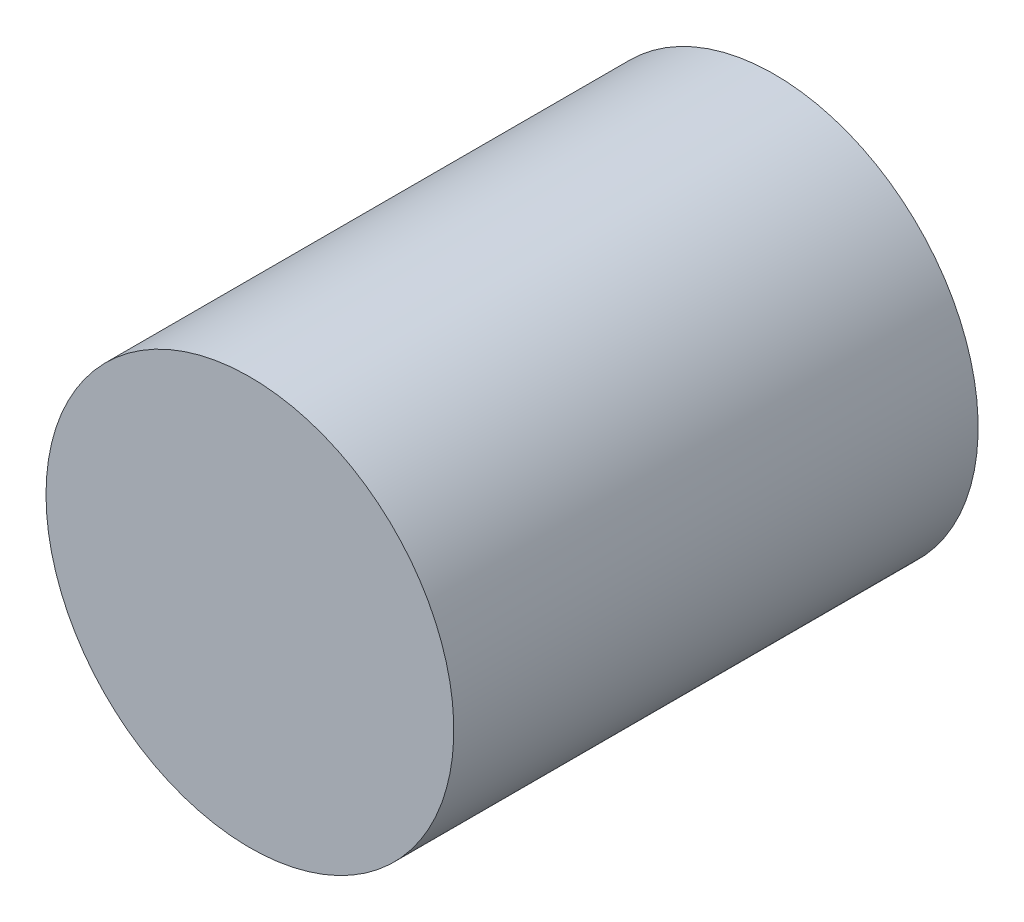
ISO-10303-21;
HEADER;
FILE_DESCRIPTION(('STEP AP214'),'2;1');
FILE_NAME('part.step','',(''),(''),'','','');
FILE_SCHEMA(('AUTOMOTIVE_DESIGN { 1 0 10303 214 1 1 1 1 }'));
ENDSEC;
DATA;
#1=APPLICATION_CONTEXT('core data for automotive mechanical design processes');
#2=APPLICATION_PROTOCOL_DEFINITION('international standard','automotive_design',2000,#1);
#3=PRODUCT_CONTEXT('',#1,'mechanical');
#4=PRODUCT('Part','Part','',(#3));
#5=PRODUCT_RELATED_PRODUCT_CATEGORY('part','',(#4));
#6=PRODUCT_DEFINITION_FORMATION('','',#4);
#7=PRODUCT_DEFINITION_CONTEXT('part definition',#1,'design');
#8=PRODUCT_DEFINITION('design','',#6,#7);
#9=PRODUCT_DEFINITION_SHAPE('','',#8);
#10=(LENGTH_UNIT() NAMED_UNIT(*) SI_UNIT(.MILLI.,.METRE.));
#11=(NAMED_UNIT(*) PLANE_ANGLE_UNIT() SI_UNIT($,.RADIAN.));
#12=(NAMED_UNIT(*) SI_UNIT($,.STERADIAN.) SOLID_ANGLE_UNIT());
#13=UNCERTAINTY_MEASURE_WITH_UNIT(LENGTH_MEASURE(1.E-05),#10,'distance_accuracy_value','');
#14=(GEOMETRIC_REPRESENTATION_CONTEXT(3) GLOBAL_UNCERTAINTY_ASSIGNED_CONTEXT((#13)) GLOBAL_UNIT_ASSIGNED_CONTEXT((#10,
#11,#12)) REPRESENTATION_CONTEXT('',''));
#15=CARTESIAN_POINT('',(0.,0.,0.));
#16=DIRECTION('',(0.,0.,1.));
#17=DIRECTION('',(1.,0.,0.));
#18=AXIS2_PLACEMENT_3D('',#15,#16,#17);
#19=CARTESIAN_POINT('',(0.,0.,45.));
#20=DIRECTION('',(0.,0.,-1.));
#21=DIRECTION('',(-1.,0.,0.));
#22=AXIS2_PLACEMENT_3D('',#19,#20,#21);
#23=CYLINDRICAL_SURFACE('',#22,17.5);
#24=CARTESIAN_POINT('',(0.,0.,45.));
#25=DIRECTION('',(0.,0.,1.));
#26=DIRECTION('',(1.,0.,0.));
#27=AXIS2_PLACEMENT_3D('',#24,#25,#26);
#28=CIRCLE('',#27,17.5);
#29=CARTESIAN_POINT('',(-17.5,0.,45.));
#30=VERTEX_POINT('',#29);
#31=EDGE_CURVE('E10',#30,#30,#28,.T.);
#32=CARTESIAN_POINT('',(0.,0.,0.));
#33=DIRECTION('',(0.,0.,1.));
#34=DIRECTION('',(1.,0.,0.));
#35=AXIS2_PLACEMENT_3D('',#32,#33,#34);
#36=CIRCLE('',#35,17.5);
#37=CARTESIAN_POINT('',(-17.5,0.,0.));
#38=VERTEX_POINT('',#37);
#39=EDGE_CURVE('E46',#38,#38,#36,.T.);
#40=CARTESIAN_POINT('',(-17.5,0.,45.));
#41=CARTESIAN_POINT('',(-17.5,0.,44.53125));
#42=CARTESIAN_POINT('',(-17.5,0.,44.0625));
#43=CARTESIAN_POINT('',(-17.5,0.,43.125));
#44=CARTESIAN_POINT('',(-17.5,0.,42.65625));
#45=CARTESIAN_POINT('',(-17.5,0.,41.71875));
#46=CARTESIAN_POINT('',(-17.5,0.,41.25));
#47=CARTESIAN_POINT('',(-17.5,0.,40.3125));
#48=CARTESIAN_POINT('',(-17.5,0.,39.84375));
#49=CARTESIAN_POINT('',(-17.5,0.,38.90625));
#50=CARTESIAN_POINT('',(-17.5,0.,38.4375));
#51=CARTESIAN_POINT('',(-17.5,0.,37.5));
#52=CARTESIAN_POINT('',(-17.5,0.,37.03125));
#53=CARTESIAN_POINT('',(-17.5,0.,36.09375));
#54=CARTESIAN_POINT('',(-17.5,0.,35.625));
#55=CARTESIAN_POINT('',(-17.5,0.,34.6875));
#56=CARTESIAN_POINT('',(-17.5,0.,34.21875));
#57=CARTESIAN_POINT('',(-17.5,0.,33.28125));
#58=CARTESIAN_POINT('',(-17.5,0.,32.8125));
#59=CARTESIAN_POINT('',(-17.5,0.,31.875));
#60=CARTESIAN_POINT('',(-17.5,0.,31.40625));
#61=CARTESIAN_POINT('',(-17.5,0.,30.46875));
#62=CARTESIAN_POINT('',(-17.5,0.,30.));
#63=CARTESIAN_POINT('',(-17.5,0.,29.0625));
#64=CARTESIAN_POINT('',(-17.5,0.,28.59375));
#65=CARTESIAN_POINT('',(-17.5,0.,27.65625));
#66=CARTESIAN_POINT('',(-17.5,0.,27.1875));
#67=CARTESIAN_POINT('',(-17.5,0.,26.25));
#68=CARTESIAN_POINT('',(-17.5,0.,25.78125));
#69=CARTESIAN_POINT('',(-17.5,0.,24.84375));
#70=CARTESIAN_POINT('',(-17.5,0.,24.375));
#71=CARTESIAN_POINT('',(-17.5,0.,23.4375));
#72=CARTESIAN_POINT('',(-17.5,0.,22.96875));
#73=CARTESIAN_POINT('',(-17.5,0.,22.03125));
#74=CARTESIAN_POINT('',(-17.5,0.,21.5625));
#75=CARTESIAN_POINT('',(-17.5,0.,20.625));
#76=CARTESIAN_POINT('',(-17.5,0.,20.15625));
#77=CARTESIAN_POINT('',(-17.5,0.,19.21875));
#78=CARTESIAN_POINT('',(-17.5,0.,18.75));
#79=CARTESIAN_POINT('',(-17.5,0.,17.8125));
#80=CARTESIAN_POINT('',(-17.5,0.,17.34375));
#81=CARTESIAN_POINT('',(-17.5,0.,16.40625));
#82=CARTESIAN_POINT('',(-17.5,0.,15.9375));
#83=CARTESIAN_POINT('',(-17.5,0.,15.));
#84=CARTESIAN_POINT('',(-17.5,0.,14.53125));
#85=CARTESIAN_POINT('',(-17.5,0.,13.59375));
#86=CARTESIAN_POINT('',(-17.5,0.,13.125));
#87=CARTESIAN_POINT('',(-17.5,0.,12.1875));
#88=CARTESIAN_POINT('',(-17.5,0.,11.71875));
#89=CARTESIAN_POINT('',(-17.5,0.,10.78125));
#90=CARTESIAN_POINT('',(-17.5,0.,10.3125));
#91=CARTESIAN_POINT('',(-17.5,0.,9.37499999999999));
#92=CARTESIAN_POINT('',(-17.5,0.,8.90624999999999));
#93=CARTESIAN_POINT('',(-17.5,0.,7.96874999999999));
#94=CARTESIAN_POINT('',(-17.5,0.,7.5));
#95=CARTESIAN_POINT('',(-17.5,0.,6.56249999999999));
#96=CARTESIAN_POINT('',(-17.5,0.,6.09374999999999));
#97=CARTESIAN_POINT('',(-17.5,0.,5.15624999999999));
#98=CARTESIAN_POINT('',(-17.5,0.,4.68749999999999));
#99=CARTESIAN_POINT('',(-17.5,0.,3.74999999999999));
#100=CARTESIAN_POINT('',(-17.5,0.,3.28124999999999));
#101=CARTESIAN_POINT('',(-17.5,0.,2.34374999999999));
#102=CARTESIAN_POINT('',(-17.5,0.,1.87499999999999));
#103=CARTESIAN_POINT('',(-17.5,0.,0.937499999999992));
#104=CARTESIAN_POINT('',(-17.5,0.,0.468749999999993));
#105=CARTESIAN_POINT('',(-17.5,0.,0.));
#106=B_SPLINE_CURVE_WITH_KNOTS('',3,(#40,#41,#42,#43,#44,#45,#46,#47,#48,#49,#50,#51,#52,#53,
#54,#55,#56,#57,#58,#59,#60,#61,#62,#63,#64,#65,#66,#67,#68,#69,#70,#71,#72,#73,#74,#75,#76,#77,
#78,#79,#80,#81,#82,#83,#84,#85,#86,#87,#88,#89,#90,#91,#92,#93,#94,#95,#96,#97,#98,#99,#100,
#101,#102,#103,#104,#105),.UNSPECIFIED.,.F.,.F.,(4,2,2,2,2,2,2,2,2,2,2,2,2,2,2,2,2,2,2,2,2,2,2,
2,2,2,2,2,2,2,2,2,4),(0.,1.40625,2.8125,4.21874999999999,5.625,7.03125,8.43749999999999,9.84375,
11.25,12.65625,14.0625,15.46875,16.875,18.28125,19.6875,21.09375,22.5,23.90625,25.3125,26.71875,
28.125,29.53125,30.9375,32.34375,33.75,35.15625,36.5625,37.96875,39.375,40.78125,42.1875,
43.59375,45.),.UNSPECIFIED.);
#107=EDGE_CURVE('BSEAM43',#30,#38,#106,.T.);
#108=ORIENTED_EDGE('',*,*,#31,.F.);
#109=ORIENTED_EDGE('',*,*,#39,.T.);
#110=ORIENTED_EDGE('',*,*,#107,.T.);
#111=ORIENTED_EDGE('',*,*,#107,.F.);
#112=EDGE_LOOP('',(#108,#110,#109,#111));
#113=FACE_BOUND('',#112,.T.);
#114=ADVANCED_FACE('F43',(#113),#23,.T.);
#115=CARTESIAN_POINT('',(0.,0.,45.));
#116=DIRECTION('',(0.,0.,1.));
#117=DIRECTION('',(1.,0.,0.));
#118=AXIS2_PLACEMENT_3D('',#115,#116,#117);
#119=PLANE('',#118);
#120=ORIENTED_EDGE('',*,*,#31,.T.);
#121=EDGE_LOOP('',(#120));
#122=FACE_BOUND('',#121,.T.);
#123=ADVANCED_FACE('F60',(#122),#119,.T.);
#124=CARTESIAN_POINT('',(0.,0.,0.));
#125=DIRECTION('',(0.,0.,1.));
#126=DIRECTION('',(1.,0.,0.));
#127=AXIS2_PLACEMENT_3D('',#124,#125,#126);
#128=PLANE('',#127);
#129=ORIENTED_EDGE('',*,*,#39,.F.);
#130=EDGE_LOOP('',(#129));
#131=FACE_BOUND('',#130,.T.);
#132=ADVANCED_FACE('F58',(#131),#128,.F.);
#133=CLOSED_SHELL('',(#114,#123,#132));
#134=MANIFOLD_SOLID_BREP('B2',#133);
#135=ADVANCED_BREP_SHAPE_REPRESENTATION('',(#18,#134),#14);
#136=SHAPE_DEFINITION_REPRESENTATION(#9,#135);
ENDSEC;
END-ISO-10303-21;
